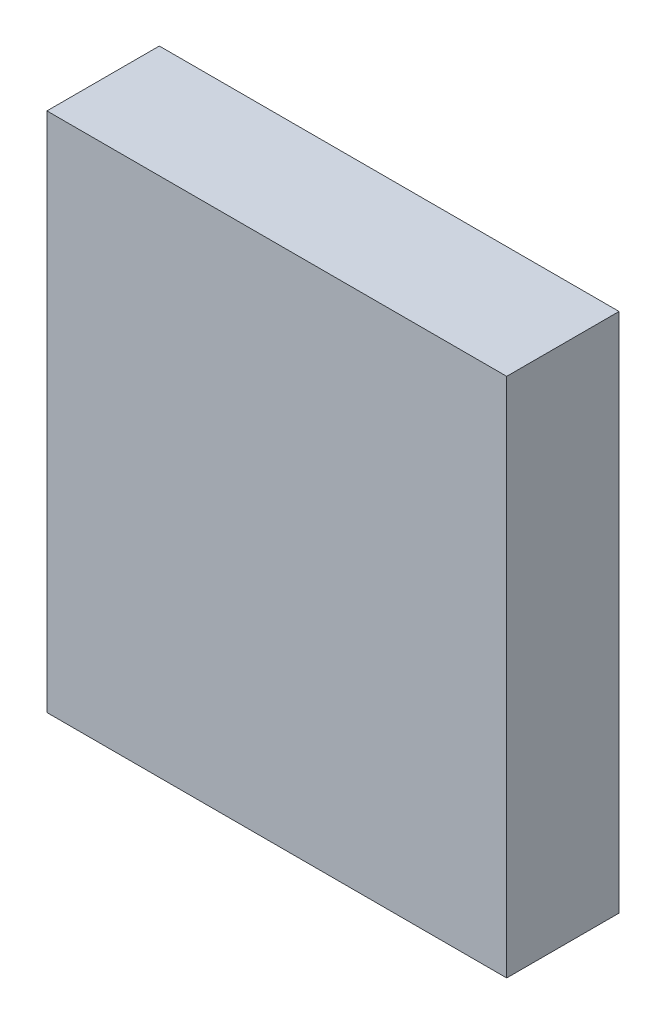
ISO-10303-21;
HEADER;
FILE_DESCRIPTION(('STEP AP214'),'2;1');
FILE_NAME('part.step','',(''),(''),'','','');
FILE_SCHEMA(('AUTOMOTIVE_DESIGN { 1 0 10303 214 1 1 1 1 }'));
ENDSEC;
DATA;
#1=APPLICATION_CONTEXT('core data for automotive mechanical design processes');
#2=APPLICATION_PROTOCOL_DEFINITION('international standard','automotive_design',2000,#1);
#3=PRODUCT_CONTEXT('',#1,'mechanical');
#4=PRODUCT('Part','Part','',(#3));
#5=PRODUCT_RELATED_PRODUCT_CATEGORY('part','',(#4));
#6=PRODUCT_DEFINITION_FORMATION('','',#4);
#7=PRODUCT_DEFINITION_CONTEXT('part definition',#1,'design');
#8=PRODUCT_DEFINITION('design','',#6,#7);
#9=PRODUCT_DEFINITION_SHAPE('','',#8);
#10=(LENGTH_UNIT() NAMED_UNIT(*) SI_UNIT(.MILLI.,.METRE.));
#11=(NAMED_UNIT(*) PLANE_ANGLE_UNIT() SI_UNIT($,.RADIAN.));
#12=(NAMED_UNIT(*) SI_UNIT($,.STERADIAN.) SOLID_ANGLE_UNIT());
#13=UNCERTAINTY_MEASURE_WITH_UNIT(LENGTH_MEASURE(1.E-05),#10,'distance_accuracy_value','');
#14=(GEOMETRIC_REPRESENTATION_CONTEXT(3) GLOBAL_UNCERTAINTY_ASSIGNED_CONTEXT((#13)) GLOBAL_UNIT_ASSIGNED_CONTEXT((#10,
#11,#12)) REPRESENTATION_CONTEXT('',''));
#15=CARTESIAN_POINT('',(0.,0.,0.));
#16=DIRECTION('',(0.,0.,1.));
#17=DIRECTION('',(1.,0.,0.));
#18=AXIS2_PLACEMENT_3D('',#15,#16,#17);
#19=CARTESIAN_POINT('',(2.25000058,-2.54999998,1.1));
#20=DIRECTION('',(0.,0.,1.));
#21=DIRECTION('',(1.,0.,0.));
#22=AXIS2_PLACEMENT_3D('',#19,#20,#21);
#23=PLANE('',#22);
#24=DIRECTION('',(1.,0.,0.));
#25=VECTOR('',#24,1.);
#26=CARTESIAN_POINT('',(-2.25000058,2.54999998,1.1));
#27=LINE('',#26,#25);
#28=CARTESIAN_POINT('',(-2.25000058,2.54999998,1.1));
#29=VERTEX_POINT('',#28);
#30=CARTESIAN_POINT('',(2.25000058,2.54999998,1.1));
#31=VERTEX_POINT('',#30);
#32=EDGE_CURVE('E58',#29,#31,#27,.T.);
#33=ORIENTED_EDGE('',*,*,#32,.F.);
#34=DIRECTION('',(0.,1.,0.));
#35=VECTOR('',#34,1.);
#36=CARTESIAN_POINT('',(-2.25000058,-2.54999998,1.1));
#37=LINE('',#36,#35);
#38=CARTESIAN_POINT('',(-2.25000058,-2.54999998,1.1));
#39=VERTEX_POINT('',#38);
#40=EDGE_CURVE('E53',#39,#29,#37,.T.);
#41=ORIENTED_EDGE('',*,*,#40,.F.);
#42=DIRECTION('',(1.,0.,0.));
#43=VECTOR('',#42,1.);
#44=CARTESIAN_POINT('',(2.25000058,-2.54999998,1.1));
#45=LINE('',#44,#43);
#46=CARTESIAN_POINT('',(2.25000058,-2.54999998,1.1));
#47=VERTEX_POINT('',#46);
#48=EDGE_CURVE('E68',#47,#39,#45,.F.);
#49=ORIENTED_EDGE('',*,*,#48,.F.);
#50=DIRECTION('',(0.,1.,0.));
#51=VECTOR('',#50,1.);
#52=CARTESIAN_POINT('',(2.25000058,2.54999998,1.1));
#53=LINE('',#52,#51);
#54=EDGE_CURVE('E20',#31,#47,#53,.F.);
#55=ORIENTED_EDGE('',*,*,#54,.F.);
#56=EDGE_LOOP('',(#33,#41,#49,#55));
#57=FACE_BOUND('',#56,.T.);
#58=ADVANCED_FACE('F17',(#57),#23,.T.);
#59=CARTESIAN_POINT('',(2.25000058,2.54999998,0.));
#60=DIRECTION('',(1.,0.,0.));
#61=DIRECTION('',(0.,0.,-1.));
#62=AXIS2_PLACEMENT_3D('',#59,#60,#61);
#63=PLANE('',#62);
#64=DIRECTION('',(0.,0.,-1.));
#65=VECTOR('',#64,1.);
#66=CARTESIAN_POINT('',(2.25000058,-2.54999998,0.));
#67=LINE('',#66,#65);
#68=CARTESIAN_POINT('',(2.25000058,-2.54999998,0.));
#69=VERTEX_POINT('',#68);
#70=EDGE_CURVE('E79',#69,#47,#67,.F.);
#71=ORIENTED_EDGE('',*,*,#70,.F.);
#72=DIRECTION('',(0.,1.,0.));
#73=VECTOR('',#72,1.);
#74=CARTESIAN_POINT('',(2.25000058,-2.54999998,0.));
#75=LINE('',#74,#73);
#76=CARTESIAN_POINT('',(2.25000058,2.54999998,0.));
#77=VERTEX_POINT('',#76);
#78=EDGE_CURVE('E74',#69,#77,#75,.T.);
#79=ORIENTED_EDGE('',*,*,#78,.T.);
#80=DIRECTION('',(0.,0.,1.));
#81=VECTOR('',#80,1.);
#82=CARTESIAN_POINT('',(2.25000058,2.54999998,0.));
#83=LINE('',#82,#81);
#84=EDGE_CURVE('E63',#31,#77,#83,.F.);
#85=ORIENTED_EDGE('',*,*,#84,.F.);
#86=ORIENTED_EDGE('',*,*,#54,.T.);
#87=EDGE_LOOP('',(#71,#79,#85,#86));
#88=FACE_BOUND('',#87,.T.);
#89=ADVANCED_FACE('F73',(#88),#63,.T.);
#90=CARTESIAN_POINT('',(-2.25000058,2.54999998,0.));
#91=DIRECTION('',(0.,1.,0.));
#92=DIRECTION('',(0.,0.,1.));
#93=AXIS2_PLACEMENT_3D('',#90,#91,#92);
#94=PLANE('',#93);
#95=ORIENTED_EDGE('',*,*,#84,.T.);
#96=DIRECTION('',(1.,0.,0.));
#97=VECTOR('',#96,1.);
#98=CARTESIAN_POINT('',(2.25000058,2.54999998,0.));
#99=LINE('',#98,#97);
#100=CARTESIAN_POINT('',(-2.25000058,2.54999998,0.));
#101=VERTEX_POINT('',#100);
#102=EDGE_CURVE('E84',#77,#101,#99,.F.);
#103=ORIENTED_EDGE('',*,*,#102,.T.);
#104=DIRECTION('',(0.,0.,1.));
#105=VECTOR('',#104,1.);
#106=CARTESIAN_POINT('',(-2.25000058,2.54999998,0.));
#107=LINE('',#106,#105);
#108=EDGE_CURVE('E65',#29,#101,#107,.F.);
#109=ORIENTED_EDGE('',*,*,#108,.F.);
#110=ORIENTED_EDGE('',*,*,#32,.T.);
#111=EDGE_LOOP('',(#95,#103,#109,#110));
#112=FACE_BOUND('',#111,.T.);
#113=ADVANCED_FACE('F60',(#112),#94,.T.);
#114=CARTESIAN_POINT('',(-2.25000058,-2.54999998,0.));
#115=DIRECTION('',(-1.,0.,0.));
#116=DIRECTION('',(0.,0.,1.));
#117=AXIS2_PLACEMENT_3D('',#114,#115,#116);
#118=PLANE('',#117);
#119=ORIENTED_EDGE('',*,*,#108,.T.);
#120=DIRECTION('',(0.,1.,0.));
#121=VECTOR('',#120,1.);
#122=CARTESIAN_POINT('',(-2.25000058,-2.54999998,0.));
#123=LINE('',#122,#121);
#124=CARTESIAN_POINT('',(-2.25000058,-2.54999998,0.));
#125=VERTEX_POINT('',#124);
#126=EDGE_CURVE('E26',#101,#125,#123,.F.);
#127=ORIENTED_EDGE('',*,*,#126,.T.);
#128=DIRECTION('',(0.,0.,-1.));
#129=VECTOR('',#128,1.);
#130=CARTESIAN_POINT('',(-2.25000058,-2.54999998,0.));
#131=LINE('',#130,#129);
#132=EDGE_CURVE('E34',#39,#125,#131,.T.);
#133=ORIENTED_EDGE('',*,*,#132,.F.);
#134=ORIENTED_EDGE('',*,*,#40,.T.);
#135=EDGE_LOOP('',(#119,#127,#133,#134));
#136=FACE_BOUND('',#135,.T.);
#137=ADVANCED_FACE('F88',(#136),#118,.T.);
#138=CARTESIAN_POINT('',(2.25000058,-2.54999998,0.));
#139=DIRECTION('',(0.,-1.,0.));
#140=DIRECTION('',(0.,0.,-1.));
#141=AXIS2_PLACEMENT_3D('',#138,#139,#140);
#142=PLANE('',#141);
#143=ORIENTED_EDGE('',*,*,#132,.T.);
#144=DIRECTION('',(1.,0.,0.));
#145=VECTOR('',#144,1.);
#146=CARTESIAN_POINT('',(2.25000058,-2.54999998,0.));
#147=LINE('',#146,#145);
#148=EDGE_CURVE('E11',#125,#69,#147,.T.);
#149=ORIENTED_EDGE('',*,*,#148,.T.);
#150=ORIENTED_EDGE('',*,*,#70,.T.);
#151=ORIENTED_EDGE('',*,*,#48,.T.);
#152=EDGE_LOOP('',(#143,#149,#150,#151));
#153=FACE_BOUND('',#152,.T.);
#154=ADVANCED_FACE('F91',(#153),#142,.T.);
#155=CARTESIAN_POINT('',(2.25000058,-2.54999998,0.));
#156=DIRECTION('',(0.,0.,1.));
#157=DIRECTION('',(1.,0.,0.));
#158=AXIS2_PLACEMENT_3D('',#155,#156,#157);
#159=PLANE('',#158);
#160=ORIENTED_EDGE('',*,*,#126,.F.);
#161=ORIENTED_EDGE('',*,*,#102,.F.);
#162=ORIENTED_EDGE('',*,*,#78,.F.);
#163=ORIENTED_EDGE('',*,*,#148,.F.);
#164=EDGE_LOOP('',(#160,#161,#162,#163));
#165=FACE_BOUND('',#164,.T.);
#166=ADVANCED_FACE('F90',(#165),#159,.F.);
#167=CLOSED_SHELL('',(#58,#89,#113,#137,#154,#166));
#168=MANIFOLD_SOLID_BREP('B1',#167);
#169=ADVANCED_BREP_SHAPE_REPRESENTATION('',(#18,#168),#14);
#170=SHAPE_DEFINITION_REPRESENTATION(#9,#169);
ENDSEC;
END-ISO-10303-21;
